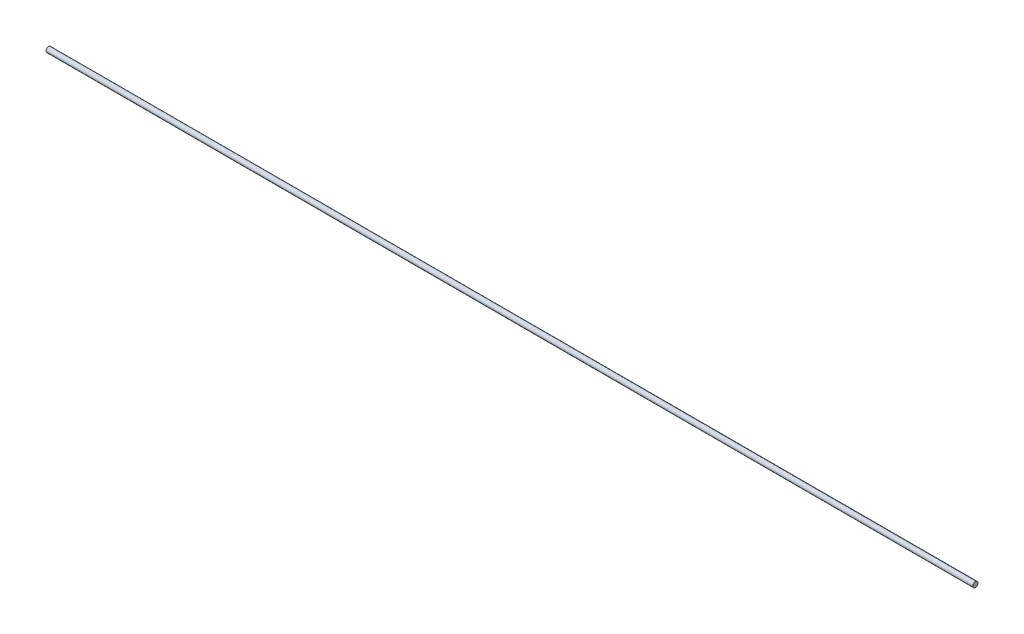
ISO-10303-21;
HEADER;
FILE_DESCRIPTION(('STEP AP214'),'2;1');
FILE_NAME('part.step','',(''),(''),'','','');
FILE_SCHEMA(('AUTOMOTIVE_DESIGN { 1 0 10303 214 1 1 1 1 }'));
ENDSEC;
DATA;
#1=APPLICATION_CONTEXT('core data for automotive mechanical design processes');
#2=APPLICATION_PROTOCOL_DEFINITION('international standard','automotive_design',2000,#1);
#3=PRODUCT_CONTEXT('',#1,'mechanical');
#4=PRODUCT('Part','Part','',(#3));
#5=PRODUCT_RELATED_PRODUCT_CATEGORY('part','',(#4));
#6=PRODUCT_DEFINITION_FORMATION('','',#4);
#7=PRODUCT_DEFINITION_CONTEXT('part definition',#1,'design');
#8=PRODUCT_DEFINITION('design','',#6,#7);
#9=PRODUCT_DEFINITION_SHAPE('','',#8);
#10=(LENGTH_UNIT() NAMED_UNIT(*) SI_UNIT(.MILLI.,.METRE.));
#11=(NAMED_UNIT(*) PLANE_ANGLE_UNIT() SI_UNIT($,.RADIAN.));
#12=(NAMED_UNIT(*) SI_UNIT($,.STERADIAN.) SOLID_ANGLE_UNIT());
#13=UNCERTAINTY_MEASURE_WITH_UNIT(LENGTH_MEASURE(1.E-05),#10,'distance_accuracy_value','');
#14=(GEOMETRIC_REPRESENTATION_CONTEXT(3) GLOBAL_UNCERTAINTY_ASSIGNED_CONTEXT((#13)) GLOBAL_UNIT_ASSIGNED_CONTEXT((#10,
#11,#12)) REPRESENTATION_CONTEXT('',''));
#15=CARTESIAN_POINT('',(0.,0.,0.));
#16=DIRECTION('',(0.,0.,1.));
#17=DIRECTION('',(1.,0.,0.));
#18=AXIS2_PLACEMENT_3D('',#15,#16,#17);
#19=CARTESIAN_POINT('',(1080.,0.,0.));
#20=DIRECTION('',(-1.,0.,0.));
#21=DIRECTION('',(0.,0.,1.));
#22=AXIS2_PLACEMENT_3D('',#19,#20,#21);
#23=CYLINDRICAL_SURFACE('',#22,3.);
#24=CARTESIAN_POINT('',(1080.,0.,0.));
#25=DIRECTION('',(1.,0.,0.));
#26=DIRECTION('',(0.,0.,-1.));
#27=AXIS2_PLACEMENT_3D('',#24,#25,#26);
#28=CIRCLE('',#27,3.);
#29=CARTESIAN_POINT('',(1080.,0.,-3.));
#30=VERTEX_POINT('',#29);
#31=EDGE_CURVE('E10',#30,#30,#28,.T.);
#32=ORIENTED_EDGE('',*,*,#31,.F.);
#33=EDGE_LOOP('',(#32));
#34=FACE_BOUND('',#33,.T.);
#35=CARTESIAN_POINT('',(0.,0.,0.));
#36=DIRECTION('',(1.,0.,0.));
#37=DIRECTION('',(0.,0.,-1.));
#38=AXIS2_PLACEMENT_3D('',#35,#36,#37);
#39=CIRCLE('',#38,3.);
#40=CARTESIAN_POINT('',(0.,0.,-3.));
#41=VERTEX_POINT('',#40);
#42=EDGE_CURVE('E40',#41,#41,#39,.T.);
#43=ORIENTED_EDGE('',*,*,#42,.T.);
#44=EDGE_LOOP('',(#43));
#45=FACE_BOUND('',#44,.T.);
#46=ADVANCED_FACE('F37',(#34,#45),#23,.T.);
#47=CARTESIAN_POINT('',(1080.,0.,0.));
#48=DIRECTION('',(1.,0.,0.));
#49=DIRECTION('',(0.,0.,-1.));
#50=AXIS2_PLACEMENT_3D('',#47,#48,#49);
#51=PLANE('',#50);
#52=ORIENTED_EDGE('',*,*,#31,.T.);
#53=EDGE_LOOP('',(#52));
#54=FACE_BOUND('',#53,.T.);
#55=ADVANCED_FACE('F54',(#54),#51,.T.);
#56=CARTESIAN_POINT('',(0.,0.,0.));
#57=DIRECTION('',(1.,0.,0.));
#58=DIRECTION('',(0.,0.,-1.));
#59=AXIS2_PLACEMENT_3D('',#56,#57,#58);
#60=PLANE('',#59);
#61=ORIENTED_EDGE('',*,*,#42,.F.);
#62=EDGE_LOOP('',(#61));
#63=FACE_BOUND('',#62,.T.);
#64=ADVANCED_FACE('F52',(#63),#60,.F.);
#65=CLOSED_SHELL('',(#46,#55,#64));
#66=MANIFOLD_SOLID_BREP('B2',#65);
#67=ADVANCED_BREP_SHAPE_REPRESENTATION('',(#18,#66),#14);
#68=SHAPE_DEFINITION_REPRESENTATION(#9,#67);
ENDSEC;
END-ISO-10303-21;
